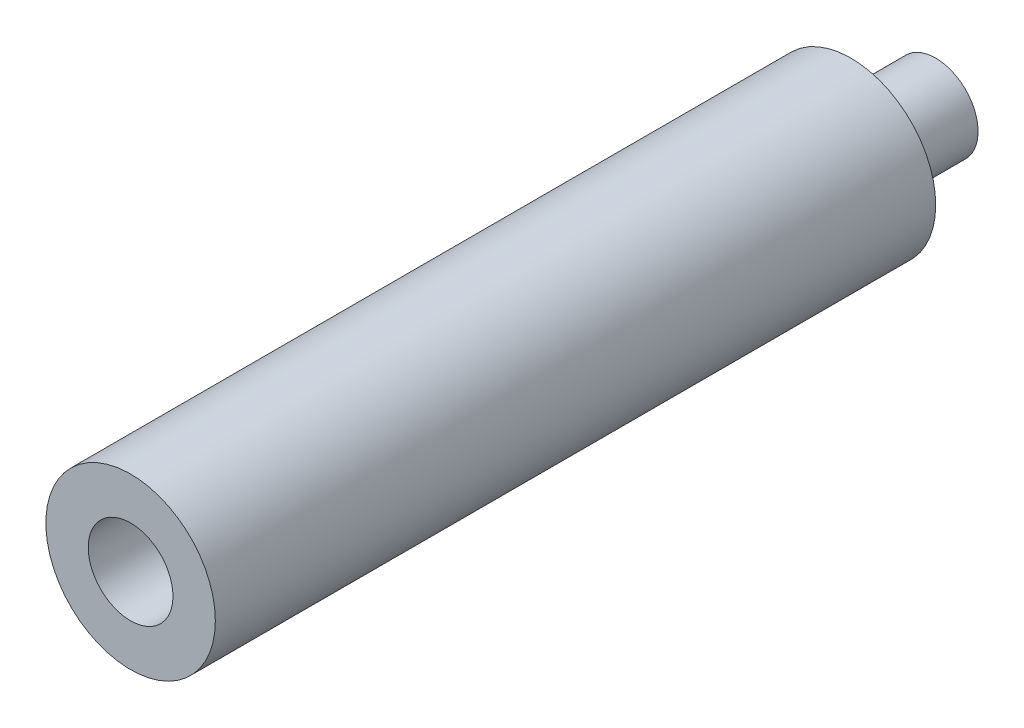
ISO-10303-21;
HEADER;
FILE_DESCRIPTION(('STEP AP214'),'2;1');
FILE_NAME('part.step','',(''),(''),'','','');
FILE_SCHEMA(('AUTOMOTIVE_DESIGN { 1 0 10303 214 1 1 1 1 }'));
ENDSEC;
DATA;
#1=APPLICATION_CONTEXT('core data for automotive mechanical design processes');
#2=APPLICATION_PROTOCOL_DEFINITION('international standard','automotive_design',2000,#1);
#3=PRODUCT_CONTEXT('',#1,'mechanical');
#4=PRODUCT('Part','Part','',(#3));
#5=PRODUCT_RELATED_PRODUCT_CATEGORY('part','',(#4));
#6=PRODUCT_DEFINITION_FORMATION('','',#4);
#7=PRODUCT_DEFINITION_CONTEXT('part definition',#1,'design');
#8=PRODUCT_DEFINITION('design','',#6,#7);
#9=PRODUCT_DEFINITION_SHAPE('','',#8);
#10=(LENGTH_UNIT() NAMED_UNIT(*) SI_UNIT(.MILLI.,.METRE.));
#11=(NAMED_UNIT(*) PLANE_ANGLE_UNIT() SI_UNIT($,.RADIAN.));
#12=(NAMED_UNIT(*) SI_UNIT($,.STERADIAN.) SOLID_ANGLE_UNIT());
#13=UNCERTAINTY_MEASURE_WITH_UNIT(LENGTH_MEASURE(1.E-05),#10,'distance_accuracy_value','');
#14=(GEOMETRIC_REPRESENTATION_CONTEXT(3) GLOBAL_UNCERTAINTY_ASSIGNED_CONTEXT((#13)) GLOBAL_UNIT_ASSIGNED_CONTEXT((#10,
#11,#12)) REPRESENTATION_CONTEXT('',''));
#15=CARTESIAN_POINT('',(0.,0.,0.));
#16=DIRECTION('',(0.,0.,1.));
#17=DIRECTION('',(1.,0.,0.));
#18=AXIS2_PLACEMENT_3D('',#15,#16,#17);
#19=CARTESIAN_POINT('',(0.,0.,170.));
#20=DIRECTION('',(0.,0.,-1.));
#21=DIRECTION('',(-1.,0.,0.));
#22=AXIS2_PLACEMENT_3D('',#19,#20,#21);
#23=CYLINDRICAL_SURFACE('',#22,20.);
#24=CARTESIAN_POINT('',(0.,0.,170.));
#25=DIRECTION('',(0.,0.,1.));
#26=DIRECTION('',(1.,0.,0.));
#27=AXIS2_PLACEMENT_3D('',#24,#25,#26);
#28=CIRCLE('',#27,20.);
#29=CARTESIAN_POINT('',(20.,0.,170.));
#30=VERTEX_POINT('',#29);
#31=EDGE_CURVE('E45',#30,#30,#28,.T.);
#32=ORIENTED_EDGE('',*,*,#31,.F.);
#33=EDGE_LOOP('',(#32));
#34=FACE_BOUND('',#33,.T.);
#35=CARTESIAN_POINT('',(0.,0.,0.));
#36=DIRECTION('',(0.,0.,1.));
#37=DIRECTION('',(1.,0.,0.));
#38=AXIS2_PLACEMENT_3D('',#35,#36,#37);
#39=CIRCLE('',#38,20.);
#40=CARTESIAN_POINT('',(20.,0.,0.));
#41=VERTEX_POINT('',#40);
#42=EDGE_CURVE('E40',#41,#41,#39,.T.);
#43=ORIENTED_EDGE('',*,*,#42,.T.);
#44=EDGE_LOOP('',(#43));
#45=FACE_BOUND('',#44,.T.);
#46=ADVANCED_FACE('F37',(#34,#45),#23,.T.);
#47=CARTESIAN_POINT('',(0.,0.,170.));
#48=DIRECTION('',(0.,0.,1.));
#49=DIRECTION('',(1.,0.,0.));
#50=AXIS2_PLACEMENT_3D('',#47,#48,#49);
#51=PLANE('',#50);
#52=CARTESIAN_POINT('',(0.,0.,170.));
#53=DIRECTION('',(0.,0.,1.));
#54=DIRECTION('',(1.,0.,0.));
#55=AXIS2_PLACEMENT_3D('',#52,#53,#54);
#56=CIRCLE('',#55,10.);
#57=CARTESIAN_POINT('',(10.,0.,170.));
#58=VERTEX_POINT('',#57);
#59=EDGE_CURVE('E57',#58,#58,#56,.T.);
#60=ORIENTED_EDGE('',*,*,#59,.F.);
#61=EDGE_LOOP('',(#60));
#62=FACE_BOUND('',#61,.T.);
#63=ORIENTED_EDGE('',*,*,#31,.T.);
#64=EDGE_LOOP('',(#63));
#65=FACE_BOUND('',#64,.T.);
#66=ADVANCED_FACE('F74',(#62,#65),#51,.T.);
#67=CARTESIAN_POINT('',(0.,0.,0.));
#68=DIRECTION('',(0.,0.,1.));
#69=DIRECTION('',(1.,0.,0.));
#70=AXIS2_PLACEMENT_3D('',#67,#68,#69);
#71=PLANE('',#70);
#72=CARTESIAN_POINT('',(0.,0.,0.));
#73=DIRECTION('',(0.,0.,-1.));
#74=DIRECTION('',(-1.,0.,0.));
#75=AXIS2_PLACEMENT_3D('',#72,#73,#74);
#76=CIRCLE('',#75,10.);
#77=CARTESIAN_POINT('',(-10.,0.,0.));
#78=VERTEX_POINT('',#77);
#79=EDGE_CURVE('E10',#78,#78,#76,.T.);
#80=ORIENTED_EDGE('',*,*,#79,.F.);
#81=EDGE_LOOP('',(#80));
#82=FACE_BOUND('',#81,.T.);
#83=ORIENTED_EDGE('',*,*,#42,.F.);
#84=EDGE_LOOP('',(#83));
#85=FACE_BOUND('',#84,.T.);
#86=ADVANCED_FACE('F77',(#82,#85),#71,.F.);
#87=CARTESIAN_POINT('',(0.,0.,-20.));
#88=DIRECTION('',(0.,0.,1.));
#89=DIRECTION('',(1.,0.,0.));
#90=AXIS2_PLACEMENT_3D('',#87,#88,#89);
#91=CYLINDRICAL_SURFACE('',#90,10.);
#92=CARTESIAN_POINT('',(0.,0.,-20.));
#93=DIRECTION('',(0.,0.,-1.));
#94=DIRECTION('',(-1.,0.,0.));
#95=AXIS2_PLACEMENT_3D('',#92,#93,#94);
#96=CIRCLE('',#95,10.);
#97=CARTESIAN_POINT('',(-10.,0.,-20.));
#98=VERTEX_POINT('',#97);
#99=EDGE_CURVE('E52',#98,#98,#96,.T.);
#100=ORIENTED_EDGE('',*,*,#99,.F.);
#101=EDGE_LOOP('',(#100));
#102=FACE_BOUND('',#101,.T.);
#103=ORIENTED_EDGE('',*,*,#79,.T.);
#104=EDGE_LOOP('',(#103));
#105=FACE_BOUND('',#104,.T.);
#106=ADVANCED_FACE('F88',(#102,#105),#91,.T.);
#107=CARTESIAN_POINT('',(0.,0.,-20.));
#108=DIRECTION('',(0.,0.,-1.));
#109=DIRECTION('',(-1.,0.,0.));
#110=AXIS2_PLACEMENT_3D('',#107,#108,#109);
#111=PLANE('',#110);
#112=ORIENTED_EDGE('',*,*,#99,.T.);
#113=EDGE_LOOP('',(#112));
#114=FACE_BOUND('',#113,.T.);
#115=ADVANCED_FACE('F70',(#114),#111,.T.);
#116=CARTESIAN_POINT('',(0.,0.,150.));
#117=DIRECTION('',(0.,0.,1.));
#118=DIRECTION('',(1.,0.,0.));
#119=AXIS2_PLACEMENT_3D('',#116,#117,#118);
#120=CYLINDRICAL_SURFACE('',#119,10.);
#121=CARTESIAN_POINT('',(0.,0.,150.));
#122=DIRECTION('',(0.,0.,1.));
#123=DIRECTION('',(1.,0.,0.));
#124=AXIS2_PLACEMENT_3D('',#121,#122,#123);
#125=CIRCLE('',#124,10.);
#126=CARTESIAN_POINT('',(10.,0.,150.));
#127=VERTEX_POINT('',#126);
#128=EDGE_CURVE('E56',#127,#127,#125,.T.);
#129=ORIENTED_EDGE('',*,*,#128,.F.);
#130=EDGE_LOOP('',(#129));
#131=FACE_BOUND('',#130,.T.);
#132=ORIENTED_EDGE('',*,*,#59,.T.);
#133=EDGE_LOOP('',(#132));
#134=FACE_BOUND('',#133,.T.);
#135=ADVANCED_FACE('F67',(#131,#134),#120,.F.);
#136=CARTESIAN_POINT('',(0.,0.,150.));
#137=DIRECTION('',(0.,0.,1.));
#138=DIRECTION('',(1.,0.,0.));
#139=AXIS2_PLACEMENT_3D('',#136,#137,#138);
#140=PLANE('',#139);
#141=ORIENTED_EDGE('',*,*,#128,.T.);
#142=EDGE_LOOP('',(#141));
#143=FACE_BOUND('',#142,.T.);
#144=ADVANCED_FACE('F65',(#143),#140,.T.);
#145=CLOSED_SHELL('',(#46,#66,#86,#106,#115,#135,#144));
#146=MANIFOLD_SOLID_BREP('B2',#145);
#147=ADVANCED_BREP_SHAPE_REPRESENTATION('',(#18,#146),#14);
#148=SHAPE_DEFINITION_REPRESENTATION(#9,#147);
ENDSEC;
END-ISO-10303-21;
